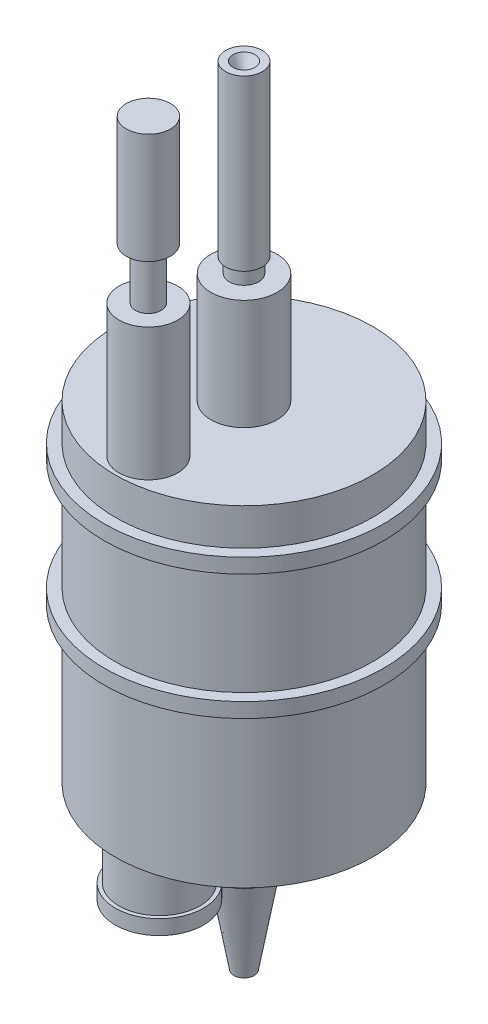
ISO-10303-21;
HEADER;
FILE_DESCRIPTION(('STEP AP214'),'2;1');
FILE_NAME('part.step','',(''),(''),'','','');
FILE_SCHEMA(('AUTOMOTIVE_DESIGN { 1 0 10303 214 1 1 1 1 }'));
ENDSEC;
DATA;
#1=APPLICATION_CONTEXT('core data for automotive mechanical design processes');
#2=APPLICATION_PROTOCOL_DEFINITION('international standard','automotive_design',2000,#1);
#3=PRODUCT_CONTEXT('',#1,'mechanical');
#4=PRODUCT('Part','Part','',(#3));
#5=PRODUCT_RELATED_PRODUCT_CATEGORY('part','',(#4));
#6=PRODUCT_DEFINITION_FORMATION('','',#4);
#7=PRODUCT_DEFINITION_CONTEXT('part definition',#1,'design');
#8=PRODUCT_DEFINITION('design','',#6,#7);
#9=PRODUCT_DEFINITION_SHAPE('','',#8);
#10=(LENGTH_UNIT() NAMED_UNIT(*) SI_UNIT(.MILLI.,.METRE.));
#11=(NAMED_UNIT(*) PLANE_ANGLE_UNIT() SI_UNIT($,.RADIAN.));
#12=(NAMED_UNIT(*) SI_UNIT($,.STERADIAN.) SOLID_ANGLE_UNIT());
#13=UNCERTAINTY_MEASURE_WITH_UNIT(LENGTH_MEASURE(1.E-05),#10,'distance_accuracy_value','');
#14=(GEOMETRIC_REPRESENTATION_CONTEXT(3) GLOBAL_UNCERTAINTY_ASSIGNED_CONTEXT((#13)) GLOBAL_UNIT_ASSIGNED_CONTEXT((#10,
#11,#12)) REPRESENTATION_CONTEXT('',''));
#15=CARTESIAN_POINT('',(0.,0.,0.));
#16=DIRECTION('',(0.,0.,1.));
#17=DIRECTION('',(1.,0.,0.));
#18=AXIS2_PLACEMENT_3D('',#15,#16,#17);
#19=CARTESIAN_POINT('',(0.,-10.,0.));
#20=DIRECTION('',(0.,1.,0.));
#21=DIRECTION('',(0.,0.,-1.));
#22=AXIS2_PLACEMENT_3D('',#19,#20,#21);
#23=CONICAL_SURFACE('',#22,3.5,0.174532925199433);
#24=CARTESIAN_POINT('',(0.,-22.,0.));
#25=DIRECTION('',(0.,-1.,0.));
#26=DIRECTION('',(0.,0.,-1.));
#27=AXIS2_PLACEMENT_3D('',#24,#25,#26);
#28=CIRCLE('',#27,1.38407623149842);
#29=CARTESIAN_POINT('',(0.,-22.,-1.38407623149842));
#30=VERTEX_POINT('',#29);
#31=EDGE_CURVE('E11',#30,#30,#28,.T.);
#32=ORIENTED_EDGE('',*,*,#31,.F.);
#33=EDGE_LOOP('',(#32));
#34=FACE_BOUND('',#33,.T.);
#35=CARTESIAN_POINT('',(0.,-10.,0.));
#36=DIRECTION('',(0.,-1.,0.));
#37=DIRECTION('',(0.,0.,-1.));
#38=AXIS2_PLACEMENT_3D('',#35,#36,#37);
#39=CIRCLE('',#38,3.5);
#40=CARTESIAN_POINT('',(0.,-10.,-3.5));
#41=VERTEX_POINT('',#40);
#42=EDGE_CURVE('E45',#41,#41,#39,.T.);
#43=ORIENTED_EDGE('',*,*,#42,.T.);
#44=EDGE_LOOP('',(#43));
#45=FACE_BOUND('',#44,.T.);
#46=ADVANCED_FACE('F38',(#34,#45),#23,.T.);
#47=CARTESIAN_POINT('',(0.,-22.,0.));
#48=DIRECTION('',(0.,-1.,0.));
#49=DIRECTION('',(0.,0.,-1.));
#50=AXIS2_PLACEMENT_3D('',#47,#48,#49);
#51=PLANE('',#50);
#52=CARTESIAN_POINT('',(0.,-22.,0.));
#53=DIRECTION('',(0.,-1.,0.));
#54=DIRECTION('',(0.,0.,-1.));
#55=AXIS2_PLACEMENT_3D('',#52,#53,#54);
#56=CIRCLE('',#55,0.6);
#57=CARTESIAN_POINT('',(0.,-22.,-0.6));
#58=VERTEX_POINT('',#57);
#59=EDGE_CURVE('E51',#58,#58,#56,.T.);
#60=ORIENTED_EDGE('',*,*,#59,.F.);
#61=EDGE_LOOP('',(#60));
#62=FACE_BOUND('',#61,.T.);
#63=ORIENTED_EDGE('',*,*,#31,.T.);
#64=EDGE_LOOP('',(#63));
#65=FACE_BOUND('',#64,.T.);
#66=ADVANCED_FACE('F67',(#62,#65),#51,.T.);
#67=CARTESIAN_POINT('',(0.,-10.,0.));
#68=DIRECTION('',(0.,-1.,0.));
#69=DIRECTION('',(0.,0.,-1.));
#70=AXIS2_PLACEMENT_3D('',#67,#68,#69);
#71=PLANE('',#70);
#72=CARTESIAN_POINT('',(0.,-9.99999999999999,0.));
#73=DIRECTION('',(0.,-1.,0.));
#74=DIRECTION('',(0.,0.,-1.));
#75=AXIS2_PLACEMENT_3D('',#72,#73,#74);
#76=CIRCLE('',#75,0.6);
#77=CARTESIAN_POINT('',(0.,-9.99999999999999,-0.6));
#78=VERTEX_POINT('',#77);
#79=EDGE_CURVE('E41',#78,#78,#76,.T.);
#80=ORIENTED_EDGE('',*,*,#79,.T.);
#81=EDGE_LOOP('',(#80));
#82=FACE_BOUND('',#81,.T.);
#83=ORIENTED_EDGE('',*,*,#42,.F.);
#84=EDGE_LOOP('',(#83));
#85=FACE_BOUND('',#84,.T.);
#86=ADVANCED_FACE('F58',(#82,#85),#71,.F.);
#87=CARTESIAN_POINT('',(0.,85.,0.));
#88=DIRECTION('',(0.,-1.,0.));
#89=DIRECTION('',(0.,0.,-1.));
#90=AXIS2_PLACEMENT_3D('',#87,#88,#89);
#91=CYLINDRICAL_SURFACE('',#90,0.6);
#92=ORIENTED_EDGE('',*,*,#59,.T.);
#93=EDGE_LOOP('',(#92));
#94=FACE_BOUND('',#93,.T.);
#95=ORIENTED_EDGE('',*,*,#79,.F.);
#96=EDGE_LOOP('',(#95));
#97=FACE_BOUND('',#96,.T.);
#98=ADVANCED_FACE('F61',(#94,#97),#91,.F.);
#99=CLOSED_SHELL('',(#46,#66,#86,#98));
#100=MANIFOLD_SOLID_BREP('B2',#99);
#101=CARTESIAN_POINT('',(0.,45.,0.));
#102=DIRECTION('',(0.,-1.,0.));
#103=DIRECTION('',(0.,0.,-1.));
#104=AXIS2_PLACEMENT_3D('',#101,#102,#103);
#105=CYLINDRICAL_SURFACE('',#104,17.5);
#106=CARTESIAN_POINT('',(0.,38.,0.));
#107=DIRECTION('',(0.,1.,0.));
#108=DIRECTION('',(0.,0.,1.));
#109=AXIS2_PLACEMENT_3D('',#106,#107,#108);
#110=CIRCLE('',#109,17.5);
#111=CARTESIAN_POINT('',(0.,38.,-17.5));
#112=VERTEX_POINT('',#111);
#113=EDGE_CURVE('E107',#112,#112,#110,.T.);
#114=CARTESIAN_POINT('',(0.,23.,0.));
#115=DIRECTION('',(0.,-1.,0.));
#116=DIRECTION('',(0.,0.,-1.));
#117=AXIS2_PLACEMENT_3D('',#114,#115,#116);
#118=CIRCLE('',#117,17.5);
#119=CARTESIAN_POINT('',(0.,23.,-17.5));
#120=VERTEX_POINT('',#119);
#121=EDGE_CURVE('E37',#120,#120,#118,.T.);
#122=CARTESIAN_POINT('',(0.,38.,-17.5));
#123=CARTESIAN_POINT('',(0.,37.84375,-17.5));
#124=CARTESIAN_POINT('',(0.,37.6875,-17.5));
#125=CARTESIAN_POINT('',(0.,37.375,-17.5));
#126=CARTESIAN_POINT('',(0.,37.21875,-17.5));
#127=CARTESIAN_POINT('',(0.,36.90625,-17.5));
#128=CARTESIAN_POINT('',(0.,36.75,-17.5));
#129=CARTESIAN_POINT('',(0.,36.4375,-17.5));
#130=CARTESIAN_POINT('',(0.,36.28125,-17.5));
#131=CARTESIAN_POINT('',(0.,35.96875,-17.5));
#132=CARTESIAN_POINT('',(0.,35.8125,-17.5));
#133=CARTESIAN_POINT('',(0.,35.5,-17.5));
#134=CARTESIAN_POINT('',(0.,35.34375,-17.5));
#135=CARTESIAN_POINT('',(0.,35.03125,-17.5));
#136=CARTESIAN_POINT('',(0.,34.875,-17.5));
#137=CARTESIAN_POINT('',(0.,34.5625,-17.5));
#138=CARTESIAN_POINT('',(0.,34.40625,-17.5));
#139=CARTESIAN_POINT('',(0.,34.09375,-17.5));
#140=CARTESIAN_POINT('',(0.,33.9375,-17.5));
#141=CARTESIAN_POINT('',(0.,33.625,-17.5));
#142=CARTESIAN_POINT('',(0.,33.46875,-17.5));
#143=CARTESIAN_POINT('',(0.,33.15625,-17.5));
#144=CARTESIAN_POINT('',(0.,33.,-17.5));
#145=CARTESIAN_POINT('',(0.,32.6875,-17.5));
#146=CARTESIAN_POINT('',(0.,32.53125,-17.5));
#147=CARTESIAN_POINT('',(0.,32.21875,-17.5));
#148=CARTESIAN_POINT('',(0.,32.0625,-17.5));
#149=CARTESIAN_POINT('',(0.,31.75,-17.5));
#150=CARTESIAN_POINT('',(0.,31.59375,-17.5));
#151=CARTESIAN_POINT('',(0.,31.28125,-17.5));
#152=CARTESIAN_POINT('',(0.,31.125,-17.5));
#153=CARTESIAN_POINT('',(0.,30.8125,-17.5));
#154=CARTESIAN_POINT('',(0.,30.65625,-17.5));
#155=CARTESIAN_POINT('',(0.,30.34375,-17.5));
#156=CARTESIAN_POINT('',(0.,30.1875,-17.5));
#157=CARTESIAN_POINT('',(0.,29.875,-17.5));
#158=CARTESIAN_POINT('',(0.,29.71875,-17.5));
#159=CARTESIAN_POINT('',(0.,29.40625,-17.5));
#160=CARTESIAN_POINT('',(0.,29.25,-17.5));
#161=CARTESIAN_POINT('',(0.,28.9375,-17.5));
#162=CARTESIAN_POINT('',(0.,28.78125,-17.5));
#163=CARTESIAN_POINT('',(0.,28.46875,-17.5));
#164=CARTESIAN_POINT('',(0.,28.3125,-17.5));
#165=CARTESIAN_POINT('',(0.,28.,-17.5));
#166=CARTESIAN_POINT('',(0.,27.84375,-17.5));
#167=CARTESIAN_POINT('',(0.,27.53125,-17.5));
#168=CARTESIAN_POINT('',(0.,27.375,-17.5));
#169=CARTESIAN_POINT('',(0.,27.0625,-17.5));
#170=CARTESIAN_POINT('',(0.,26.90625,-17.5));
#171=CARTESIAN_POINT('',(0.,26.59375,-17.5));
#172=CARTESIAN_POINT('',(0.,26.4375,-17.5));
#173=CARTESIAN_POINT('',(0.,26.125,-17.5));
#174=CARTESIAN_POINT('',(0.,25.96875,-17.5));
#175=CARTESIAN_POINT('',(0.,25.65625,-17.5));
#176=CARTESIAN_POINT('',(0.,25.5,-17.5));
#177=CARTESIAN_POINT('',(0.,25.1875,-17.5));
#178=CARTESIAN_POINT('',(0.,25.03125,-17.5));
#179=CARTESIAN_POINT('',(0.,24.71875,-17.5));
#180=CARTESIAN_POINT('',(0.,24.5625,-17.5));
#181=CARTESIAN_POINT('',(0.,24.25,-17.5));
#182=CARTESIAN_POINT('',(0.,24.09375,-17.5));
#183=CARTESIAN_POINT('',(0.,23.78125,-17.5));
#184=CARTESIAN_POINT('',(0.,23.625,-17.5));
#185=CARTESIAN_POINT('',(0.,23.3125,-17.5));
#186=CARTESIAN_POINT('',(0.,23.15625,-17.5));
#187=CARTESIAN_POINT('',(0.,23.,-17.5));
#188=B_SPLINE_CURVE_WITH_KNOTS('',3,(#122,#123,#124,#125,#126,#127,#128,#129,#130,#131,#132,
#133,#134,#135,#136,#137,#138,#139,#140,#141,#142,#143,#144,#145,#146,#147,#148,#149,#150,#151,
#152,#153,#154,#155,#156,#157,#158,#159,#160,#161,#162,#163,#164,#165,#166,#167,#168,#169,#170,
#171,#172,#173,#174,#175,#176,#177,#178,#179,#180,#181,#182,#183,#184,#185,#186,#187),
.UNSPECIFIED.,.F.,.F.,(4,2,2,2,2,2,2,2,2,2,2,2,2,2,2,2,2,2,2,2,2,2,2,2,2,2,2,2,2,2,2,2,4),(0.,
0.468750000000004,0.937500000000001,1.40625,1.875,2.34375,2.8125,3.28125000000001,3.75,4.21875,
4.6875,5.15625,5.62500000000001,6.09375,6.56250000000001,7.03125,7.5,7.96875,8.4375,8.90625,
9.375,9.84375,10.3125,10.78125,11.25,11.71875,12.1875,12.65625,13.125,13.59375,14.0625,14.53125,
15.),.UNSPECIFIED.);
#189=EDGE_CURVE('BSEAM99',#112,#120,#188,.T.);
#190=ORIENTED_EDGE('',*,*,#113,.F.);
#191=ORIENTED_EDGE('',*,*,#121,.F.);
#192=ORIENTED_EDGE('',*,*,#189,.T.);
#193=ORIENTED_EDGE('',*,*,#189,.F.);
#194=EDGE_LOOP('',(#190,#192,#191,#193));
#195=FACE_BOUND('',#194,.T.);
#196=ADVANCED_FACE('F99',(#195),#105,.T.);
#197=CARTESIAN_POINT('',(0.,63.,13.));
#198=DIRECTION('',(0.,1.,0.));
#199=DIRECTION('',(0.,0.,1.));
#200=AXIS2_PLACEMENT_3D('',#197,#198,#199);
#201=PLANE('',#200);
#202=CARTESIAN_POINT('',(0.,63.,13.));
#203=DIRECTION('',(0.,1.,0.));
#204=DIRECTION('',(0.,0.,1.));
#205=AXIS2_PLACEMENT_3D('',#202,#203,#204);
#206=CIRCLE('',#205,4.);
#207=CARTESIAN_POINT('',(0.,63.,17.));
#208=VERTEX_POINT('',#207);
#209=EDGE_CURVE('E157',#208,#208,#206,.T.);
#210=ORIENTED_EDGE('',*,*,#209,.T.);
#211=EDGE_LOOP('',(#210));
#212=FACE_BOUND('',#211,.T.);
#213=CARTESIAN_POINT('',(0.,63.,13.));
#214=DIRECTION('',(0.,1.,0.));
#215=DIRECTION('',(0.,0.,1.));
#216=AXIS2_PLACEMENT_3D('',#213,#214,#215);
#217=CIRCLE('',#216,1.75);
#218=CARTESIAN_POINT('',(0.,63.,14.75));
#219=VERTEX_POINT('',#218);
#220=EDGE_CURVE('E147',#219,#219,#217,.T.);
#221=ORIENTED_EDGE('',*,*,#220,.F.);
#222=EDGE_LOOP('',(#221));
#223=FACE_BOUND('',#222,.T.);
#224=ADVANCED_FACE('F230',(#212,#223),#201,.T.);
#225=CARTESIAN_POINT('',(0.,45.,0.));
#226=DIRECTION('',(0.,1.,0.));
#227=DIRECTION('',(0.,0.,1.));
#228=AXIS2_PLACEMENT_3D('',#225,#226,#227);
#229=PLANE('',#228);
#230=CARTESIAN_POINT('',(0.,45.,0.));
#231=DIRECTION('',(0.,1.,0.));
#232=DIRECTION('',(0.,0.,1.));
#233=AXIS2_PLACEMENT_3D('',#230,#231,#232);
#234=CIRCLE('',#233,4.5);
#235=CARTESIAN_POINT('',(0.,45.,4.5));
#236=VERTEX_POINT('',#235);
#237=EDGE_CURVE('E172',#236,#236,#234,.T.);
#238=ORIENTED_EDGE('',*,*,#237,.F.);
#239=EDGE_LOOP('',(#238));
#240=FACE_BOUND('',#239,.T.);
#241=CARTESIAN_POINT('',(0.,45.,0.));
#242=DIRECTION('',(0.,1.,0.));
#243=DIRECTION('',(0.,0.,1.));
#244=AXIS2_PLACEMENT_3D('',#241,#242,#243);
#245=CIRCLE('',#244,17.5);
#246=CARTESIAN_POINT('',(0.,45.,-17.5));
#247=VERTEX_POINT('',#246);
#248=EDGE_CURVE('E196',#247,#247,#245,.T.);
#249=ORIENTED_EDGE('',*,*,#248,.T.);
#250=EDGE_LOOP('',(#249));
#251=FACE_BOUND('',#250,.T.);
#252=CARTESIAN_POINT('',(0.,45.,13.));
#253=DIRECTION('',(0.,1.,0.));
#254=DIRECTION('',(0.,0.,1.));
#255=AXIS2_PLACEMENT_3D('',#252,#253,#254);
#256=CIRCLE('',#255,4.);
#257=CARTESIAN_POINT('',(0.,45.,17.));
#258=VERTEX_POINT('',#257);
#259=EDGE_CURVE('E154',#258,#258,#256,.T.);
#260=ORIENTED_EDGE('',*,*,#259,.F.);
#261=EDGE_LOOP('',(#260));
#262=FACE_BOUND('',#261,.T.);
#263=ADVANCED_FACE('F236',(#240,#251,#262),#229,.T.);
#264=CARTESIAN_POINT('',(0.,60.,0.));
#265=DIRECTION('',(0.,1.,0.));
#266=DIRECTION('',(0.,0.,1.));
#267=AXIS2_PLACEMENT_3D('',#264,#265,#266);
#268=PLANE('',#267);
#269=CARTESIAN_POINT('',(0.,60.,0.));
#270=DIRECTION('',(0.,1.,0.));
#271=DIRECTION('',(0.,0.,1.));
#272=AXIS2_PLACEMENT_3D('',#269,#270,#271);
#273=CIRCLE('',#272,4.5);
#274=CARTESIAN_POINT('',(0.,60.,4.5));
#275=VERTEX_POINT('',#274);
#276=EDGE_CURVE('E175',#275,#275,#273,.T.);
#277=ORIENTED_EDGE('',*,*,#276,.T.);
#278=EDGE_LOOP('',(#277));
#279=FACE_BOUND('',#278,.T.);
#280=CARTESIAN_POINT('',(0.,60.,0.));
#281=DIRECTION('',(0.,1.,0.));
#282=DIRECTION('',(0.,0.,1.));
#283=AXIS2_PLACEMENT_3D('',#280,#281,#282);
#284=CIRCLE('',#283,2.);
#285=CARTESIAN_POINT('',(0.,60.,2.));
#286=VERTEX_POINT('',#285);
#287=EDGE_CURVE('E166',#286,#286,#284,.T.);
#288=ORIENTED_EDGE('',*,*,#287,.F.);
#289=EDGE_LOOP('',(#288));
#290=FACE_BOUND('',#289,.T.);
#291=ADVANCED_FACE('F247',(#279,#290),#268,.T.);
#292=CARTESIAN_POINT('',(0.,40.,0.));
#293=DIRECTION('',(0.,1.,0.));
#294=DIRECTION('',(0.,0.,1.));
#295=AXIS2_PLACEMENT_3D('',#292,#293,#294);
#296=CIRCLE('',#295,17.5);
#297=CARTESIAN_POINT('',(0.,40.,-17.5));
#298=VERTEX_POINT('',#297);
#299=EDGE_CURVE('E141',#298,#298,#296,.T.);
#300=CARTESIAN_POINT('',(0.,40.,-17.5));
#301=CARTESIAN_POINT('',(0.,40.0520833333333,-17.5));
#302=CARTESIAN_POINT('',(0.,40.1041666666667,-17.5));
#303=CARTESIAN_POINT('',(0.,40.2083333333333,-17.5));
#304=CARTESIAN_POINT('',(0.,40.2604166666667,-17.5));
#305=CARTESIAN_POINT('',(0.,40.3645833333333,-17.5));
#306=CARTESIAN_POINT('',(0.,40.4166666666667,-17.5));
#307=CARTESIAN_POINT('',(0.,40.5208333333333,-17.5));
#308=CARTESIAN_POINT('',(0.,40.5729166666667,-17.5));
#309=CARTESIAN_POINT('',(0.,40.6770833333333,-17.5));
#310=CARTESIAN_POINT('',(0.,40.7291666666667,-17.5));
#311=CARTESIAN_POINT('',(0.,40.8333333333333,-17.5));
#312=CARTESIAN_POINT('',(0.,40.8854166666667,-17.5));
#313=CARTESIAN_POINT('',(0.,40.9895833333333,-17.5));
#314=CARTESIAN_POINT('',(0.,41.0416666666667,-17.5));
#315=CARTESIAN_POINT('',(0.,41.1458333333333,-17.5));
#316=CARTESIAN_POINT('',(0.,41.1979166666667,-17.5));
#317=CARTESIAN_POINT('',(0.,41.3020833333333,-17.5));
#318=CARTESIAN_POINT('',(0.,41.3541666666667,-17.5));
#319=CARTESIAN_POINT('',(0.,41.4583333333333,-17.5));
#320=CARTESIAN_POINT('',(0.,41.5104166666667,-17.5));
#321=CARTESIAN_POINT('',(0.,41.6145833333333,-17.5));
#322=CARTESIAN_POINT('',(0.,41.6666666666667,-17.5));
#323=CARTESIAN_POINT('',(0.,41.7708333333333,-17.5));
#324=CARTESIAN_POINT('',(0.,41.8229166666667,-17.5));
#325=CARTESIAN_POINT('',(0.,41.9270833333333,-17.5));
#326=CARTESIAN_POINT('',(0.,41.9791666666667,-17.5));
#327=CARTESIAN_POINT('',(0.,42.0833333333333,-17.5));
#328=CARTESIAN_POINT('',(0.,42.1354166666667,-17.5));
#329=CARTESIAN_POINT('',(0.,42.2395833333333,-17.5));
#330=CARTESIAN_POINT('',(0.,42.2916666666667,-17.5));
#331=CARTESIAN_POINT('',(0.,42.3958333333333,-17.5));
#332=CARTESIAN_POINT('',(0.,42.4479166666667,-17.5));
#333=CARTESIAN_POINT('',(0.,42.5520833333333,-17.5));
#334=CARTESIAN_POINT('',(0.,42.6041666666667,-17.5));
#335=CARTESIAN_POINT('',(0.,42.7083333333333,-17.5));
#336=CARTESIAN_POINT('',(0.,42.7604166666667,-17.5));
#337=CARTESIAN_POINT('',(0.,42.8645833333333,-17.5));
#338=CARTESIAN_POINT('',(0.,42.9166666666667,-17.5));
#339=CARTESIAN_POINT('',(0.,43.0208333333333,-17.5));
#340=CARTESIAN_POINT('',(0.,43.0729166666667,-17.5));
#341=CARTESIAN_POINT('',(0.,43.1770833333333,-17.5));
#342=CARTESIAN_POINT('',(0.,43.2291666666667,-17.5));
#343=CARTESIAN_POINT('',(0.,43.3333333333333,-17.5));
#344=CARTESIAN_POINT('',(0.,43.3854166666667,-17.5));
#345=CARTESIAN_POINT('',(0.,43.4895833333333,-17.5));
#346=CARTESIAN_POINT('',(0.,43.5416666666667,-17.5));
#347=CARTESIAN_POINT('',(0.,43.6458333333333,-17.5));
#348=CARTESIAN_POINT('',(0.,43.6979166666667,-17.5));
#349=CARTESIAN_POINT('',(0.,43.8020833333333,-17.5));
#350=CARTESIAN_POINT('',(0.,43.8541666666667,-17.5));
#351=CARTESIAN_POINT('',(0.,43.9583333333333,-17.5));
#352=CARTESIAN_POINT('',(0.,44.0104166666667,-17.5));
#353=CARTESIAN_POINT('',(0.,44.1145833333333,-17.5));
#354=CARTESIAN_POINT('',(0.,44.1666666666667,-17.5));
#355=CARTESIAN_POINT('',(0.,44.2708333333333,-17.5));
#356=CARTESIAN_POINT('',(0.,44.3229166666667,-17.5));
#357=CARTESIAN_POINT('',(0.,44.4270833333333,-17.5));
#358=CARTESIAN_POINT('',(0.,44.4791666666667,-17.5));
#359=CARTESIAN_POINT('',(0.,44.5833333333333,-17.5));
#360=CARTESIAN_POINT('',(0.,44.6354166666667,-17.5));
#361=CARTESIAN_POINT('',(0.,44.7395833333333,-17.5));
#362=CARTESIAN_POINT('',(0.,44.7916666666667,-17.5));
#363=CARTESIAN_POINT('',(0.,44.8958333333333,-17.5));
#364=CARTESIAN_POINT('',(0.,44.9479166666667,-17.5));
#365=CARTESIAN_POINT('',(0.,45.,-17.5));
#366=B_SPLINE_CURVE_WITH_KNOTS('',3,(#300,#301,#302,#303,#304,#305,#306,#307,#308,#309,#310,
#311,#312,#313,#314,#315,#316,#317,#318,#319,#320,#321,#322,#323,#324,#325,#326,#327,#328,#329,
#330,#331,#332,#333,#334,#335,#336,#337,#338,#339,#340,#341,#342,#343,#344,#345,#346,#347,#348,
#349,#350,#351,#352,#353,#354,#355,#356,#357,#358,#359,#360,#361,#362,#363,#364,#365),
.UNSPECIFIED.,.F.,.F.,(4,2,2,2,2,2,2,2,2,2,2,2,2,2,2,2,2,2,2,2,2,2,2,2,2,2,2,2,2,2,2,2,4),(0.,
0.156249999999997,0.3125,0.468749999999997,0.624999999999994,0.781249999999997,
0.937499999999994,1.09375,1.24999999999999,1.40625,1.56249999999999,1.71875,1.87499999999999,
2.03125,2.1875,2.34375,2.5,2.65625,2.8125,2.96874999999999,3.125,3.28124999999999,3.4375,
3.59374999999999,3.75,3.90624999999999,4.0625,4.21874999999999,4.375,4.53124999999999,4.6875,
4.84374999999999,5.),.UNSPECIFIED.);
#367=EDGE_CURVE('BSEAM101',#298,#247,#366,.T.);
#368=ORIENTED_EDGE('',*,*,#299,.T.);
#369=ORIENTED_EDGE('',*,*,#248,.F.);
#370=ORIENTED_EDGE('',*,*,#367,.T.);
#371=ORIENTED_EDGE('',*,*,#367,.F.);
#372=EDGE_LOOP('',(#368,#370,#369,#371));
#373=FACE_BOUND('',#372,.T.);
#374=ADVANCED_FACE('F101',(#373),#105,.T.);
#375=CARTESIAN_POINT('',(0.,60.,0.));
#376=DIRECTION('',(0.,-1.,0.));
#377=DIRECTION('',(0.,0.,-1.));
#378=AXIS2_PLACEMENT_3D('',#375,#376,#377);
#379=CYLINDRICAL_SURFACE('',#378,4.5);
#380=ORIENTED_EDGE('',*,*,#276,.F.);
#381=EDGE_LOOP('',(#380));
#382=FACE_BOUND('',#381,.T.);
#383=ORIENTED_EDGE('',*,*,#237,.T.);
#384=EDGE_LOOP('',(#383));
#385=FACE_BOUND('',#384,.T.);
#386=ADVANCED_FACE('F246',(#382,#385),#379,.T.);
#387=CARTESIAN_POINT('',(0.,62.,0.));
#388=DIRECTION('',(0.,-1.,0.));
#389=DIRECTION('',(0.,0.,-1.));
#390=AXIS2_PLACEMENT_3D('',#387,#388,#389);
#391=CYLINDRICAL_SURFACE('',#390,2.);
#392=CARTESIAN_POINT('',(0.,62.,0.));
#393=DIRECTION('',(0.,1.,0.));
#394=DIRECTION('',(0.,0.,1.));
#395=AXIS2_PLACEMENT_3D('',#392,#393,#394);
#396=CIRCLE('',#395,2.);
#397=CARTESIAN_POINT('',(0.,62.,2.));
#398=VERTEX_POINT('',#397);
#399=EDGE_CURVE('E169',#398,#398,#396,.T.);
#400=ORIENTED_EDGE('',*,*,#399,.F.);
#401=EDGE_LOOP('',(#400));
#402=FACE_BOUND('',#401,.T.);
#403=ORIENTED_EDGE('',*,*,#287,.T.);
#404=EDGE_LOOP('',(#403));
#405=FACE_BOUND('',#404,.T.);
#406=ADVANCED_FACE('F252',(#402,#405),#391,.T.);
#407=CARTESIAN_POINT('',(0.,62.,0.));
#408=DIRECTION('',(0.,1.,0.));
#409=DIRECTION('',(0.,0.,1.));
#410=AXIS2_PLACEMENT_3D('',#407,#408,#409);
#411=PLANE('',#410);
#412=CARTESIAN_POINT('',(0.,62.,0.));
#413=DIRECTION('',(0.,1.,0.));
#414=DIRECTION('',(0.,0.,1.));
#415=AXIS2_PLACEMENT_3D('',#412,#413,#414);
#416=CIRCLE('',#415,2.5);
#417=CARTESIAN_POINT('',(0.,62.,2.5));
#418=VERTEX_POINT('',#417);
#419=EDGE_CURVE('E160',#418,#418,#416,.T.);
#420=ORIENTED_EDGE('',*,*,#419,.F.);
#421=EDGE_LOOP('',(#420));
#422=FACE_BOUND('',#421,.T.);
#423=ORIENTED_EDGE('',*,*,#399,.T.);
#424=EDGE_LOOP('',(#423));
#425=FACE_BOUND('',#424,.T.);
#426=ADVANCED_FACE('F453',(#422,#425),#411,.F.);
#427=CARTESIAN_POINT('',(0.,85.,0.));
#428=DIRECTION('',(0.,-1.,0.));
#429=DIRECTION('',(0.,0.,-1.));
#430=AXIS2_PLACEMENT_3D('',#427,#428,#429);
#431=CYLINDRICAL_SURFACE('',#430,2.5);
#432=CARTESIAN_POINT('',(0.,85.,0.));
#433=DIRECTION('',(0.,1.,0.));
#434=DIRECTION('',(0.,0.,1.));
#435=AXIS2_PLACEMENT_3D('',#432,#433,#434);
#436=CIRCLE('',#435,2.5);
#437=CARTESIAN_POINT('',(0.,85.,2.5));
#438=VERTEX_POINT('',#437);
#439=EDGE_CURVE('E163',#438,#438,#436,.T.);
#440=ORIENTED_EDGE('',*,*,#439,.F.);
#441=EDGE_LOOP('',(#440));
#442=FACE_BOUND('',#441,.T.);
#443=ORIENTED_EDGE('',*,*,#419,.T.);
#444=EDGE_LOOP('',(#443));
#445=FACE_BOUND('',#444,.T.);
#446=ADVANCED_FACE('F445',(#442,#445),#431,.T.);
#447=CARTESIAN_POINT('',(0.,85.,0.));
#448=DIRECTION('',(0.,1.,0.));
#449=DIRECTION('',(0.,0.,1.));
#450=AXIS2_PLACEMENT_3D('',#447,#448,#449);
#451=PLANE('',#450);
#452=CARTESIAN_POINT('',(0.,85.,0.));
#453=DIRECTION('',(0.,1.,0.));
#454=DIRECTION('',(0.,0.,1.));
#455=AXIS2_PLACEMENT_3D('',#452,#453,#454);
#456=CIRCLE('',#455,1.5);
#457=CARTESIAN_POINT('',(0.,85.,1.5));
#458=VERTEX_POINT('',#457);
#459=EDGE_CURVE('E128',#458,#458,#456,.T.);
#460=ORIENTED_EDGE('',*,*,#459,.F.);
#461=EDGE_LOOP('',(#460));
#462=FACE_BOUND('',#461,.T.);
#463=ORIENTED_EDGE('',*,*,#439,.T.);
#464=EDGE_LOOP('',(#463));
#465=FACE_BOUND('',#464,.T.);
#466=ADVANCED_FACE('F431',(#462,#465),#451,.T.);
#467=CARTESIAN_POINT('',(0.,63.,13.));
#468=DIRECTION('',(0.,-1.,0.));
#469=DIRECTION('',(0.,0.,-1.));
#470=AXIS2_PLACEMENT_3D('',#467,#468,#469);
#471=CYLINDRICAL_SURFACE('',#470,4.);
#472=ORIENTED_EDGE('',*,*,#209,.F.);
#473=EDGE_LOOP('',(#472));
#474=FACE_BOUND('',#473,.T.);
#475=ORIENTED_EDGE('',*,*,#259,.T.);
#476=EDGE_LOOP('',(#475));
#477=FACE_BOUND('',#476,.T.);
#478=ADVANCED_FACE('F417',(#474,#477),#471,.T.);
#479=CARTESIAN_POINT('',(0.,70.,13.));
#480=DIRECTION('',(0.,-1.,0.));
#481=DIRECTION('',(0.,0.,-1.));
#482=AXIS2_PLACEMENT_3D('',#479,#480,#481);
#483=CYLINDRICAL_SURFACE('',#482,1.75);
#484=CARTESIAN_POINT('',(0.,70.,13.));
#485=DIRECTION('',(0.,1.,0.));
#486=DIRECTION('',(0.,0.,1.));
#487=AXIS2_PLACEMENT_3D('',#484,#485,#486);
#488=CIRCLE('',#487,1.75);
#489=CARTESIAN_POINT('',(0.,70.,14.75));
#490=VERTEX_POINT('',#489);
#491=EDGE_CURVE('E151',#490,#490,#488,.T.);
#492=ORIENTED_EDGE('',*,*,#491,.F.);
#493=EDGE_LOOP('',(#492));
#494=FACE_BOUND('',#493,.T.);
#495=ORIENTED_EDGE('',*,*,#220,.T.);
#496=EDGE_LOOP('',(#495));
#497=FACE_BOUND('',#496,.T.);
#498=ADVANCED_FACE('F408',(#494,#497),#483,.T.);
#499=CARTESIAN_POINT('',(0.,70.,13.));
#500=DIRECTION('',(0.,1.,0.));
#501=DIRECTION('',(0.,0.,1.));
#502=AXIS2_PLACEMENT_3D('',#499,#500,#501);
#503=PLANE('',#502);
#504=CARTESIAN_POINT('',(0.,70.,13.));
#505=DIRECTION('',(0.,1.,0.));
#506=DIRECTION('',(0.,0.,1.));
#507=AXIS2_PLACEMENT_3D('',#504,#505,#506);
#508=CIRCLE('',#507,3.);
#509=CARTESIAN_POINT('',(0.,70.,16.));
#510=VERTEX_POINT('',#509);
#511=EDGE_CURVE('E148',#510,#510,#508,.T.);
#512=ORIENTED_EDGE('',*,*,#511,.F.);
#513=EDGE_LOOP('',(#512));
#514=FACE_BOUND('',#513,.T.);
#515=ORIENTED_EDGE('',*,*,#491,.T.);
#516=EDGE_LOOP('',(#515));
#517=FACE_BOUND('',#516,.T.);
#518=ADVANCED_FACE('F399',(#514,#517),#503,.F.);
#519=CARTESIAN_POINT('',(0.,85.,13.));
#520=DIRECTION('',(0.,-1.,0.));
#521=DIRECTION('',(0.,0.,-1.));
#522=AXIS2_PLACEMENT_3D('',#519,#520,#521);
#523=CYLINDRICAL_SURFACE('',#522,3.);
#524=CARTESIAN_POINT('',(0.,85.,13.));
#525=DIRECTION('',(0.,1.,0.));
#526=DIRECTION('',(0.,0.,1.));
#527=AXIS2_PLACEMENT_3D('',#524,#525,#526);
#528=CIRCLE('',#527,3.);
#529=CARTESIAN_POINT('',(0.,85.,16.));
#530=VERTEX_POINT('',#529);
#531=EDGE_CURVE('E144',#530,#530,#528,.T.);
#532=ORIENTED_EDGE('',*,*,#531,.F.);
#533=EDGE_LOOP('',(#532));
#534=FACE_BOUND('',#533,.T.);
#535=ORIENTED_EDGE('',*,*,#511,.T.);
#536=EDGE_LOOP('',(#535));
#537=FACE_BOUND('',#536,.T.);
#538=ADVANCED_FACE('F390',(#534,#537),#523,.T.);
#539=CARTESIAN_POINT('',(0.,85.,13.));
#540=DIRECTION('',(0.,1.,0.));
#541=DIRECTION('',(0.,0.,1.));
#542=AXIS2_PLACEMENT_3D('',#539,#540,#541);
#543=PLANE('',#542);
#544=ORIENTED_EDGE('',*,*,#531,.T.);
#545=EDGE_LOOP('',(#544));
#546=FACE_BOUND('',#545,.T.);
#547=ADVANCED_FACE('F226',(#546),#543,.T.);
#548=CARTESIAN_POINT('',(0.,38.,0.));
#549=DIRECTION('',(0.,1.,0.));
#550=DIRECTION('',(0.,0.,1.));
#551=AXIS2_PLACEMENT_3D('',#548,#549,#550);
#552=PLANE('',#551);
#553=CARTESIAN_POINT('',(0.,38.,0.));
#554=DIRECTION('',(0.,1.,0.));
#555=DIRECTION('',(0.,0.,1.));
#556=AXIS2_PLACEMENT_3D('',#553,#554,#555);
#557=CIRCLE('',#556,19.);
#558=CARTESIAN_POINT('',(0.,38.,19.));
#559=VERTEX_POINT('',#558);
#560=EDGE_CURVE('E138',#559,#559,#557,.T.);
#561=ORIENTED_EDGE('',*,*,#560,.F.);
#562=EDGE_LOOP('',(#561));
#563=FACE_BOUND('',#562,.T.);
#564=ORIENTED_EDGE('',*,*,#113,.T.);
#565=EDGE_LOOP('',(#564));
#566=FACE_BOUND('',#565,.T.);
#567=ADVANCED_FACE('F216',(#563,#566),#552,.F.);
#568=CARTESIAN_POINT('',(0.,40.,0.));
#569=DIRECTION('',(0.,1.,0.));
#570=DIRECTION('',(0.,0.,1.));
#571=AXIS2_PLACEMENT_3D('',#568,#569,#570);
#572=PLANE('',#571);
#573=CARTESIAN_POINT('',(0.,40.,0.));
#574=DIRECTION('',(0.,1.,0.));
#575=DIRECTION('',(0.,0.,1.));
#576=AXIS2_PLACEMENT_3D('',#573,#574,#575);
#577=CIRCLE('',#576,19.);
#578=CARTESIAN_POINT('',(0.,40.,19.));
#579=VERTEX_POINT('',#578);
#580=EDGE_CURVE('E118',#579,#579,#577,.T.);
#581=ORIENTED_EDGE('',*,*,#580,.T.);
#582=EDGE_LOOP('',(#581));
#583=FACE_BOUND('',#582,.T.);
#584=ORIENTED_EDGE('',*,*,#299,.F.);
#585=EDGE_LOOP('',(#584));
#586=FACE_BOUND('',#585,.T.);
#587=ADVANCED_FACE('F213',(#583,#586),#572,.T.);
#588=CARTESIAN_POINT('',(0.,38.,0.));
#589=DIRECTION('',(0.,1.,0.));
#590=DIRECTION('',(0.,0.,1.));
#591=AXIS2_PLACEMENT_3D('',#588,#589,#590);
#592=CYLINDRICAL_SURFACE('',#591,19.);
#593=ORIENTED_EDGE('',*,*,#560,.T.);
#594=EDGE_LOOP('',(#593));
#595=FACE_BOUND('',#594,.T.);
#596=ORIENTED_EDGE('',*,*,#580,.F.);
#597=EDGE_LOOP('',(#596));
#598=FACE_BOUND('',#597,.T.);
#599=ADVANCED_FACE('F215',(#595,#598),#592,.T.);
#600=CARTESIAN_POINT('',(0.,21.,0.));
#601=DIRECTION('',(0.,-1.,0.));
#602=DIRECTION('',(0.,0.,-1.));
#603=AXIS2_PLACEMENT_3D('',#600,#601,#602);
#604=PLANE('',#603);
#605=CARTESIAN_POINT('',(0.,21.,0.));
#606=DIRECTION('',(0.,-1.,0.));
#607=DIRECTION('',(0.,0.,-1.));
#608=AXIS2_PLACEMENT_3D('',#605,#606,#607);
#609=CIRCLE('',#608,19.);
#610=CARTESIAN_POINT('',(0.,21.,-19.));
#611=VERTEX_POINT('',#610);
#612=EDGE_CURVE('E119',#611,#611,#609,.T.);
#613=ORIENTED_EDGE('',*,*,#612,.T.);
#614=EDGE_LOOP('',(#613));
#615=FACE_BOUND('',#614,.T.);
#616=CARTESIAN_POINT('',(0.,21.,0.));
#617=DIRECTION('',(0.,-1.,0.));
#618=DIRECTION('',(0.,0.,-1.));
#619=AXIS2_PLACEMENT_3D('',#616,#617,#618);
#620=CIRCLE('',#619,17.5);
#621=CARTESIAN_POINT('',(0.,21.,-17.5));
#622=VERTEX_POINT('',#621);
#623=EDGE_CURVE('E116',#622,#622,#620,.T.);
#624=ORIENTED_EDGE('',*,*,#623,.F.);
#625=EDGE_LOOP('',(#624));
#626=FACE_BOUND('',#625,.T.);
#627=ADVANCED_FACE('F223',(#615,#626),#604,.T.);
#628=CARTESIAN_POINT('',(0.,23.,0.));
#629=DIRECTION('',(0.,-1.,0.));
#630=DIRECTION('',(0.,0.,-1.));
#631=AXIS2_PLACEMENT_3D('',#628,#629,#630);
#632=PLANE('',#631);
#633=CARTESIAN_POINT('',(0.,23.,0.));
#634=DIRECTION('',(0.,-1.,0.));
#635=DIRECTION('',(0.,0.,-1.));
#636=AXIS2_PLACEMENT_3D('',#633,#634,#635);
#637=CIRCLE('',#636,19.);
#638=CARTESIAN_POINT('',(0.,23.,-19.));
#639=VERTEX_POINT('',#638);
#640=EDGE_CURVE('E122',#639,#639,#637,.T.);
#641=ORIENTED_EDGE('',*,*,#640,.F.);
#642=EDGE_LOOP('',(#641));
#643=FACE_BOUND('',#642,.T.);
#644=ORIENTED_EDGE('',*,*,#121,.T.);
#645=EDGE_LOOP('',(#644));
#646=FACE_BOUND('',#645,.T.);
#647=ADVANCED_FACE('F345',(#643,#646),#632,.F.);
#648=CARTESIAN_POINT('',(0.,21.,0.));
#649=DIRECTION('',(0.,1.,0.));
#650=DIRECTION('',(0.,0.,1.));
#651=AXIS2_PLACEMENT_3D('',#648,#649,#650);
#652=CYLINDRICAL_SURFACE('',#651,19.);
#653=ORIENTED_EDGE('',*,*,#612,.F.);
#654=EDGE_LOOP('',(#653));
#655=FACE_BOUND('',#654,.T.);
#656=ORIENTED_EDGE('',*,*,#640,.T.);
#657=EDGE_LOOP('',(#656));
#658=FACE_BOUND('',#657,.T.);
#659=ADVANCED_FACE('F286',(#655,#658),#652,.T.);
#660=CARTESIAN_POINT('',(0.,-8.,11.5));
#661=DIRECTION('',(0.,-1.,0.));
#662=DIRECTION('',(0.,0.,-1.));
#663=AXIS2_PLACEMENT_3D('',#660,#661,#662);
#664=PLANE('',#663);
#665=CARTESIAN_POINT('',(0.,-8.,11.5));
#666=DIRECTION('',(0.,-1.,0.));
#667=DIRECTION('',(0.,0.,-1.));
#668=AXIS2_PLACEMENT_3D('',#665,#666,#667);
#669=CIRCLE('',#668,6.);
#670=CARTESIAN_POINT('',(0.,-8.,5.50000000000001));
#671=VERTEX_POINT('',#670);
#672=EDGE_CURVE('E178',#671,#671,#669,.T.);
#673=ORIENTED_EDGE('',*,*,#672,.T.);
#674=EDGE_LOOP('',(#673));
#675=FACE_BOUND('',#674,.T.);
#676=ADVANCED_FACE('F279',(#675),#664,.T.);
#677=CARTESIAN_POINT('',(0.,-10.,0.));
#678=DIRECTION('',(0.,-1.,0.));
#679=DIRECTION('',(0.,0.,-1.));
#680=AXIS2_PLACEMENT_3D('',#677,#678,#679);
#681=PLANE('',#680);
#682=CARTESIAN_POINT('',(0.,-9.99999999999999,0.));
#683=DIRECTION('',(0.,-1.,0.));
#684=DIRECTION('',(0.,0.,-1.));
#685=AXIS2_PLACEMENT_3D('',#682,#683,#684);
#686=CIRCLE('',#685,0.6);
#687=CARTESIAN_POINT('',(0.,-9.99999999999999,-0.6));
#688=VERTEX_POINT('',#687);
#689=EDGE_CURVE('E120',#688,#688,#686,.T.);
#690=ORIENTED_EDGE('',*,*,#689,.F.);
#691=EDGE_LOOP('',(#690));
#692=FACE_BOUND('',#691,.T.);
#693=CARTESIAN_POINT('',(0.,-10.,0.));
#694=DIRECTION('',(0.,-1.,0.));
#695=DIRECTION('',(0.,0.,-1.));
#696=AXIS2_PLACEMENT_3D('',#693,#694,#695);
#697=CIRCLE('',#696,2.5);
#698=CARTESIAN_POINT('',(0.,-10.,-2.5));
#699=VERTEX_POINT('',#698);
#700=EDGE_CURVE('E187',#699,#699,#697,.T.);
#701=ORIENTED_EDGE('',*,*,#700,.T.);
#702=EDGE_LOOP('',(#701));
#703=FACE_BOUND('',#702,.T.);
#704=ADVANCED_FACE('F275',(#692,#703),#681,.T.);
#705=CARTESIAN_POINT('',(0.,-6.,11.5));
#706=DIRECTION('',(0.,-1.,0.));
#707=DIRECTION('',(0.,0.,-1.));
#708=AXIS2_PLACEMENT_3D('',#705,#706,#707);
#709=CYLINDRICAL_SURFACE('',#708,6.);
#710=CARTESIAN_POINT('',(0.,-6.,11.5));
#711=DIRECTION('',(0.,-1.,0.));
#712=DIRECTION('',(0.,0.,-1.));
#713=AXIS2_PLACEMENT_3D('',#710,#711,#712);
#714=CIRCLE('',#713,6.);
#715=CARTESIAN_POINT('',(0.,-6.,5.50000000000001));
#716=VERTEX_POINT('',#715);
#717=EDGE_CURVE('E181',#716,#716,#714,.T.);
#718=ORIENTED_EDGE('',*,*,#717,.T.);
#719=EDGE_LOOP('',(#718));
#720=FACE_BOUND('',#719,.T.);
#721=ORIENTED_EDGE('',*,*,#672,.F.);
#722=EDGE_LOOP('',(#721));
#723=FACE_BOUND('',#722,.T.);
#724=ADVANCED_FACE('F272',(#720,#723),#709,.T.);
#725=CARTESIAN_POINT('',(0.,-10.,0.));
#726=DIRECTION('',(0.,1.,0.));
#727=DIRECTION('',(0.,0.,1.));
#728=AXIS2_PLACEMENT_3D('',#725,#726,#727);
#729=CYLINDRICAL_SURFACE('',#728,2.5);
#730=ORIENTED_EDGE('',*,*,#700,.F.);
#731=EDGE_LOOP('',(#730));
#732=FACE_BOUND('',#731,.T.);
#733=CARTESIAN_POINT('',(0.,-8.,0.));
#734=DIRECTION('',(0.,-1.,0.));
#735=DIRECTION('',(0.,0.,-1.));
#736=AXIS2_PLACEMENT_3D('',#733,#734,#735);
#737=CIRCLE('',#736,2.5);
#738=CARTESIAN_POINT('',(0.,-8.,-2.5));
#739=VERTEX_POINT('',#738);
#740=EDGE_CURVE('E184',#739,#739,#737,.T.);
#741=ORIENTED_EDGE('',*,*,#740,.T.);
#742=EDGE_LOOP('',(#741));
#743=FACE_BOUND('',#742,.T.);
#744=ADVANCED_FACE('F270',(#732,#743),#729,.T.);
#745=CARTESIAN_POINT('',(0.,-6.,11.5));
#746=DIRECTION('',(0.,-1.,0.));
#747=DIRECTION('',(0.,0.,-1.));
#748=AXIS2_PLACEMENT_3D('',#745,#746,#747);
#749=PLANE('',#748);
#750=ORIENTED_EDGE('',*,*,#717,.F.);
#751=EDGE_LOOP('',(#750));
#752=FACE_BOUND('',#751,.T.);
#753=CARTESIAN_POINT('',(0.,-6.,11.5));
#754=DIRECTION('',(0.,-1.,0.));
#755=DIRECTION('',(0.,0.,-1.));
#756=AXIS2_PLACEMENT_3D('',#753,#754,#755);
#757=CIRCLE('',#756,5.5);
#758=CARTESIAN_POINT('',(0.,-6.,6.00000000000001));
#759=VERTEX_POINT('',#758);
#760=EDGE_CURVE('E112',#759,#759,#757,.T.);
#761=ORIENTED_EDGE('',*,*,#760,.T.);
#762=EDGE_LOOP('',(#761));
#763=FACE_BOUND('',#762,.T.);
#764=ADVANCED_FACE('F266',(#752,#763),#749,.F.);
#765=CARTESIAN_POINT('',(0.,-8.,0.));
#766=DIRECTION('',(0.,-1.,0.));
#767=DIRECTION('',(0.,0.,-1.));
#768=AXIS2_PLACEMENT_3D('',#765,#766,#767);
#769=PLANE('',#768);
#770=CARTESIAN_POINT('',(0.,-8.,0.));
#771=DIRECTION('',(0.,-1.,0.));
#772=DIRECTION('',(0.,0.,-1.));
#773=AXIS2_PLACEMENT_3D('',#770,#771,#772);
#774=CIRCLE('',#773,3.5);
#775=CARTESIAN_POINT('',(0.,-8.,-3.5));
#776=VERTEX_POINT('',#775);
#777=EDGE_CURVE('E190',#776,#776,#774,.T.);
#778=ORIENTED_EDGE('',*,*,#777,.T.);
#779=EDGE_LOOP('',(#778));
#780=FACE_BOUND('',#779,.T.);
#781=ORIENTED_EDGE('',*,*,#740,.F.);
#782=EDGE_LOOP('',(#781));
#783=FACE_BOUND('',#782,.T.);
#784=ADVANCED_FACE('F269',(#780,#783),#769,.T.);
#785=CARTESIAN_POINT('',(0.,-8.,11.5));
#786=DIRECTION('',(0.,1.,0.));
#787=DIRECTION('',(0.,0.,1.));
#788=AXIS2_PLACEMENT_3D('',#785,#786,#787);
#789=CYLINDRICAL_SURFACE('',#788,5.5);
#790=CARTESIAN_POINT('',(0.,0.,11.5));
#791=DIRECTION('',(0.,1.,0.));
#792=DIRECTION('',(0.,0.,1.));
#793=AXIS2_PLACEMENT_3D('',#790,#791,#792);
#794=CIRCLE('',#793,5.5);
#795=CARTESIAN_POINT('',(0.,0.,17.));
#796=VERTEX_POINT('',#795);
#797=EDGE_CURVE('E204',#796,#796,#794,.F.);
#798=ORIENTED_EDGE('',*,*,#797,.T.);
#799=EDGE_LOOP('',(#798));
#800=FACE_BOUND('',#799,.T.);
#801=ORIENTED_EDGE('',*,*,#760,.F.);
#802=EDGE_LOOP('',(#801));
#803=FACE_BOUND('',#802,.T.);
#804=ADVANCED_FACE('F288',(#800,#803),#789,.T.);
#805=CARTESIAN_POINT('',(0.,-8.,0.));
#806=DIRECTION('',(0.,1.,0.));
#807=DIRECTION('',(0.,0.,1.));
#808=AXIS2_PLACEMENT_3D('',#805,#806,#807);
#809=CYLINDRICAL_SURFACE('',#808,3.5);
#810=ORIENTED_EDGE('',*,*,#777,.F.);
#811=EDGE_LOOP('',(#810));
#812=FACE_BOUND('',#811,.T.);
#813=CARTESIAN_POINT('',(0.,0.,0.));
#814=DIRECTION('',(0.,1.,0.));
#815=DIRECTION('',(0.,0.,1.));
#816=AXIS2_PLACEMENT_3D('',#813,#814,#815);
#817=CIRCLE('',#816,3.5);
#818=CARTESIAN_POINT('',(0.,0.,3.5));
#819=VERTEX_POINT('',#818);
#820=EDGE_CURVE('E199',#819,#819,#817,.F.);
#821=ORIENTED_EDGE('',*,*,#820,.T.);
#822=EDGE_LOOP('',(#821));
#823=FACE_BOUND('',#822,.T.);
#824=ADVANCED_FACE('F291',(#812,#823),#809,.T.);
#825=CARTESIAN_POINT('',(0.,0.,0.));
#826=DIRECTION('',(0.,1.,0.));
#827=DIRECTION('',(0.,0.,1.));
#828=AXIS2_PLACEMENT_3D('',#825,#826,#827);
#829=PLANE('',#828);
#830=ORIENTED_EDGE('',*,*,#820,.F.);
#831=EDGE_LOOP('',(#830));
#832=FACE_BOUND('',#831,.T.);
#833=CARTESIAN_POINT('',(0.,0.,0.));
#834=DIRECTION('',(0.,1.,0.));
#835=DIRECTION('',(0.,0.,1.));
#836=AXIS2_PLACEMENT_3D('',#833,#834,#835);
#837=CIRCLE('',#836,17.5);
#838=CARTESIAN_POINT('',(0.,0.,-17.5));
#839=VERTEX_POINT('',#838);
#840=EDGE_CURVE('E195',#839,#839,#837,.T.);
#841=ORIENTED_EDGE('',*,*,#840,.F.);
#842=EDGE_LOOP('',(#841));
#843=FACE_BOUND('',#842,.T.);
#844=ORIENTED_EDGE('',*,*,#797,.F.);
#845=EDGE_LOOP('',(#844));
#846=FACE_BOUND('',#845,.T.);
#847=ADVANCED_FACE('F243',(#832,#843,#846),#829,.F.);
#848=CARTESIAN_POINT('',(0.,21.,-17.5));
#849=CARTESIAN_POINT('',(0.,20.78125,-17.5));
#850=CARTESIAN_POINT('',(0.,20.5625,-17.5));
#851=CARTESIAN_POINT('',(0.,20.125,-17.5));
#852=CARTESIAN_POINT('',(0.,19.90625,-17.5));
#853=CARTESIAN_POINT('',(0.,19.46875,-17.5));
#854=CARTESIAN_POINT('',(0.,19.25,-17.5));
#855=CARTESIAN_POINT('',(0.,18.8125,-17.5));
#856=CARTESIAN_POINT('',(0.,18.59375,-17.5));
#857=CARTESIAN_POINT('',(0.,18.15625,-17.5));
#858=CARTESIAN_POINT('',(0.,17.9375,-17.5));
#859=CARTESIAN_POINT('',(0.,17.5,-17.5));
#860=CARTESIAN_POINT('',(0.,17.28125,-17.5));
#861=CARTESIAN_POINT('',(0.,16.84375,-17.5));
#862=CARTESIAN_POINT('',(0.,16.625,-17.5));
#863=CARTESIAN_POINT('',(0.,16.1875,-17.5));
#864=CARTESIAN_POINT('',(0.,15.96875,-17.5));
#865=CARTESIAN_POINT('',(0.,15.53125,-17.5));
#866=CARTESIAN_POINT('',(0.,15.3125,-17.5));
#867=CARTESIAN_POINT('',(0.,14.875,-17.5));
#868=CARTESIAN_POINT('',(0.,14.65625,-17.5));
#869=CARTESIAN_POINT('',(0.,14.21875,-17.5));
#870=CARTESIAN_POINT('',(0.,14.,-17.5));
#871=CARTESIAN_POINT('',(0.,13.5625,-17.5));
#872=CARTESIAN_POINT('',(0.,13.34375,-17.5));
#873=CARTESIAN_POINT('',(0.,12.90625,-17.5));
#874=CARTESIAN_POINT('',(0.,12.6875,-17.5));
#875=CARTESIAN_POINT('',(0.,12.25,-17.5));
#876=CARTESIAN_POINT('',(0.,12.03125,-17.5));
#877=CARTESIAN_POINT('',(0.,11.59375,-17.5));
#878=CARTESIAN_POINT('',(0.,11.375,-17.5));
#879=CARTESIAN_POINT('',(0.,10.9375,-17.5));
#880=CARTESIAN_POINT('',(0.,10.71875,-17.5));
#881=CARTESIAN_POINT('',(0.,10.28125,-17.5));
#882=CARTESIAN_POINT('',(0.,10.0625,-17.5));
#883=CARTESIAN_POINT('',(0.,9.62499999999999,-17.5));
#884=CARTESIAN_POINT('',(0.,9.40624999999999,-17.5));
#885=CARTESIAN_POINT('',(0.,8.96875,-17.5));
#886=CARTESIAN_POINT('',(0.,8.75,-17.5));
#887=CARTESIAN_POINT('',(0.,8.31249999999999,-17.5));
#888=CARTESIAN_POINT('',(0.,8.09374999999999,-17.5));
#889=CARTESIAN_POINT('',(0.,7.65624999999999,-17.5));
#890=CARTESIAN_POINT('',(0.,7.4375,-17.5));
#891=CARTESIAN_POINT('',(0.,6.99999999999999,-17.5));
#892=CARTESIAN_POINT('',(0.,6.78124999999999,-17.5));
#893=CARTESIAN_POINT('',(0.,6.34374999999999,-17.5));
#894=CARTESIAN_POINT('',(0.,6.12499999999999,-17.5));
#895=CARTESIAN_POINT('',(0.,5.6875,-17.5));
#896=CARTESIAN_POINT('',(0.,5.46875,-17.5));
#897=CARTESIAN_POINT('',(0.,5.03125,-17.5));
#898=CARTESIAN_POINT('',(0.,4.81249999999999,-17.5));
#899=CARTESIAN_POINT('',(0.,4.37499999999999,-17.5));
#900=CARTESIAN_POINT('',(0.,4.15624999999999,-17.5));
#901=CARTESIAN_POINT('',(0.,3.71874999999999,-17.5));
#902=CARTESIAN_POINT('',(0.,3.49999999999999,-17.5));
#903=CARTESIAN_POINT('',(0.,3.06249999999999,-17.5));
#904=CARTESIAN_POINT('',(0.,2.84374999999999,-17.5));
#905=CARTESIAN_POINT('',(0.,2.40625,-17.5));
#906=CARTESIAN_POINT('',(0.,2.1875,-17.5));
#907=CARTESIAN_POINT('',(0.,1.75,-17.5));
#908=CARTESIAN_POINT('',(0.,1.53125,-17.5));
#909=CARTESIAN_POINT('',(0.,1.09374999999999,-17.5));
#910=CARTESIAN_POINT('',(0.,0.874999999999992,-17.5));
#911=CARTESIAN_POINT('',(0.,0.437499999999991,-17.5));
#912=CARTESIAN_POINT('',(0.,0.218749999999992,-17.5));
#913=CARTESIAN_POINT('',(0.,0.,-17.5));
#914=B_SPLINE_CURVE_WITH_KNOTS('',3,(#848,#849,#850,#851,#852,#853,#854,#855,#856,#857,#858,
#859,#860,#861,#862,#863,#864,#865,#866,#867,#868,#869,#870,#871,#872,#873,#874,#875,#876,#877,
#878,#879,#880,#881,#882,#883,#884,#885,#886,#887,#888,#889,#890,#891,#892,#893,#894,#895,#896,
#897,#898,#899,#900,#901,#902,#903,#904,#905,#906,#907,#908,#909,#910,#911,#912,#913),
.UNSPECIFIED.,.F.,.F.,(4,2,2,2,2,2,2,2,2,2,2,2,2,2,2,2,2,2,2,2,2,2,2,2,2,2,2,2,2,2,2,2,4),(0.,
0.656250000000001,1.3125,1.96875,2.625,3.28125,3.9375,4.59375,5.25,5.90625,6.5625,7.21875,7.875,
8.53125,9.1875,9.84374999999999,10.5,11.15625,11.8125,12.46875,13.125,13.78125,14.4375,15.09375,
15.75,16.40625,17.0625,17.71875,18.375,19.03125,19.6875,20.34375,21.),.UNSPECIFIED.);
#915=EDGE_CURVE('BSEAM232',#622,#839,#914,.T.);
#916=ORIENTED_EDGE('',*,*,#623,.T.);
#917=ORIENTED_EDGE('',*,*,#840,.T.);
#918=ORIENTED_EDGE('',*,*,#915,.T.);
#919=ORIENTED_EDGE('',*,*,#915,.F.);
#920=EDGE_LOOP('',(#916,#918,#917,#919));
#921=FACE_BOUND('',#920,.T.);
#922=ADVANCED_FACE('F232',(#921),#105,.T.);
#923=CARTESIAN_POINT('',(0.,85.,0.));
#924=DIRECTION('',(0.,-1.,0.));
#925=DIRECTION('',(0.,0.,-1.));
#926=AXIS2_PLACEMENT_3D('',#923,#924,#925);
#927=CYLINDRICAL_SURFACE('',#926,0.6);
#928=CARTESIAN_POINT('',(0.,83.441154273188,0.));
#929=DIRECTION('',(0.,1.,0.));
#930=DIRECTION('',(0.,0.,1.));
#931=AXIS2_PLACEMENT_3D('',#928,#929,#930);
#932=CIRCLE('',#931,0.6);
#933=CARTESIAN_POINT('',(0.,83.441154273188,0.6));
#934=VERTEX_POINT('',#933);
#935=EDGE_CURVE('E103',#934,#934,#932,.T.);
#936=ORIENTED_EDGE('',*,*,#935,.T.);
#937=EDGE_LOOP('',(#936));
#938=FACE_BOUND('',#937,.T.);
#939=ORIENTED_EDGE('',*,*,#689,.T.);
#940=EDGE_LOOP('',(#939));
#941=FACE_BOUND('',#940,.T.);
#942=ADVANCED_FACE('F242',(#938,#941),#927,.F.);
#943=CARTESIAN_POINT('',(0.,85.,0.));
#944=DIRECTION('',(0.,1.,0.));
#945=DIRECTION('',(0.,0.,1.));
#946=AXIS2_PLACEMENT_3D('',#943,#944,#945);
#947=CONICAL_SURFACE('',#946,1.5,0.5235987755983);
#948=ORIENTED_EDGE('',*,*,#459,.T.);
#949=EDGE_LOOP('',(#948));
#950=FACE_BOUND('',#949,.T.);
#951=ORIENTED_EDGE('',*,*,#935,.F.);
#952=EDGE_LOOP('',(#951));
#953=FACE_BOUND('',#952,.T.);
#954=ADVANCED_FACE('F326',(#950,#953),#947,.F.);
#955=CLOSED_SHELL('',(#196,#224,#263,#291,#374,#386,#406,#426,#446,#466,#478,#498,#518,#538,
#547,#567,#587,#599,#627,#647,#659,#676,#704,#724,#744,#764,#784,#804,#824,#847,#922,#942,#954));
#956=MANIFOLD_SOLID_BREP('B6',#955);
#957=ADVANCED_BREP_SHAPE_REPRESENTATION('',(#18,#100,#956),#14);
#958=SHAPE_DEFINITION_REPRESENTATION(#9,#957);
ENDSEC;
END-ISO-10303-21;
